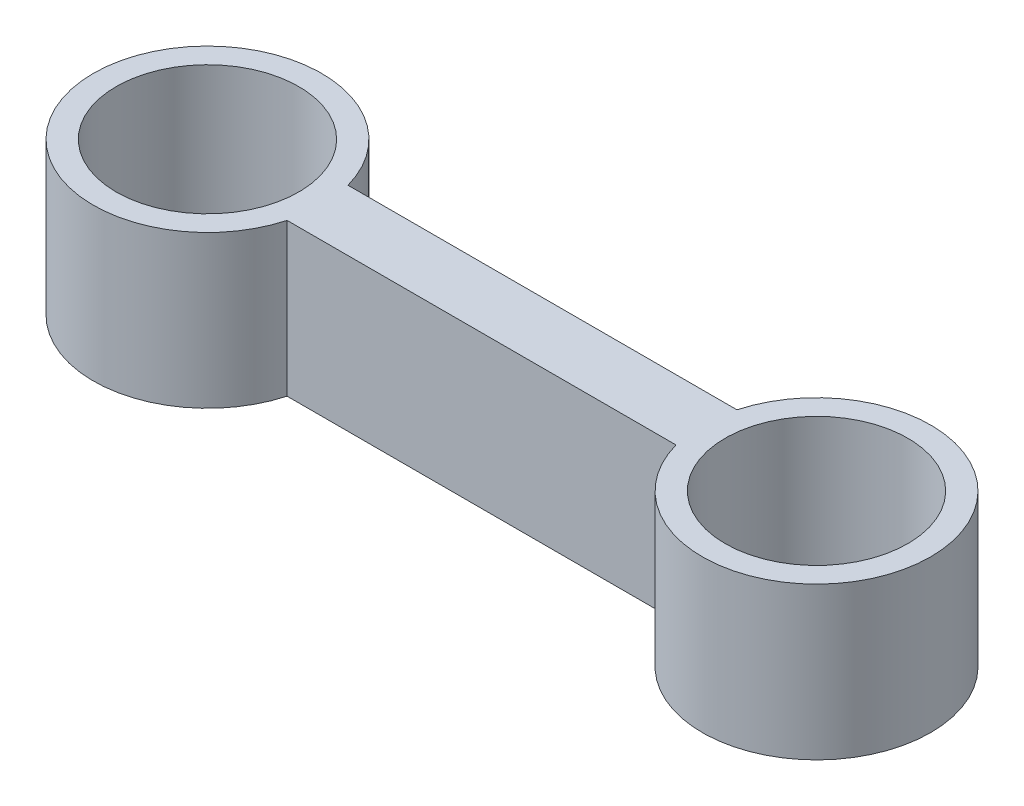
ISO-10303-21;
HEADER;
FILE_DESCRIPTION(('STEP AP214'),'2;1');
FILE_NAME('part.step','',(''),(''),'','','');
FILE_SCHEMA(('AUTOMOTIVE_DESIGN { 1 0 10303 214 1 1 1 1 }'));
ENDSEC;
DATA;
#1=APPLICATION_CONTEXT('core data for automotive mechanical design processes');
#2=APPLICATION_PROTOCOL_DEFINITION('international standard','automotive_design',2000,#1);
#3=PRODUCT_CONTEXT('',#1,'mechanical');
#4=PRODUCT('Part','Part','',(#3));
#5=PRODUCT_RELATED_PRODUCT_CATEGORY('part','',(#4));
#6=PRODUCT_DEFINITION_FORMATION('','',#4);
#7=PRODUCT_DEFINITION_CONTEXT('part definition',#1,'design');
#8=PRODUCT_DEFINITION('design','',#6,#7);
#9=PRODUCT_DEFINITION_SHAPE('','',#8);
#10=(LENGTH_UNIT() NAMED_UNIT(*) SI_UNIT(.MILLI.,.METRE.));
#11=(NAMED_UNIT(*) PLANE_ANGLE_UNIT() SI_UNIT($,.RADIAN.));
#12=(NAMED_UNIT(*) SI_UNIT($,.STERADIAN.) SOLID_ANGLE_UNIT());
#13=UNCERTAINTY_MEASURE_WITH_UNIT(LENGTH_MEASURE(1.E-05),#10,'distance_accuracy_value','');
#14=(GEOMETRIC_REPRESENTATION_CONTEXT(3) GLOBAL_UNCERTAINTY_ASSIGNED_CONTEXT((#13)) GLOBAL_UNIT_ASSIGNED_CONTEXT((#10,
#11,#12)) REPRESENTATION_CONTEXT('',''));
#15=CARTESIAN_POINT('',(0.,0.,0.));
#16=DIRECTION('',(0.,0.,1.));
#17=DIRECTION('',(1.,0.,0.));
#18=AXIS2_PLACEMENT_3D('',#15,#16,#17);
#19=CARTESIAN_POINT('',(0.,0.5,-0.2));
#20=DIRECTION('',(0.,0.,-1.));
#21=DIRECTION('',(-1.,0.,0.));
#22=AXIS2_PLACEMENT_3D('',#19,#20,#21);
#23=PLANE('',#22);
#24=DIRECTION('',(1.,0.,0.));
#25=VECTOR('',#24,1.);
#26=CARTESIAN_POINT('',(0.,-0.5,-0.2));
#27=LINE('',#26,#25);
#28=CARTESIAN_POINT('',(-1.27715838525995,-0.5,-0.2));
#29=VERTEX_POINT('',#28);
#30=CARTESIAN_POINT('',(1.27715838525995,-0.5,-0.2));
#31=VERTEX_POINT('',#30);
#32=EDGE_CURVE('E113',#29,#31,#27,.T.);
#33=ORIENTED_EDGE('',*,*,#32,.F.);
#34=DIRECTION('',(0.,-1.,0.));
#35=VECTOR('',#34,1.);
#36=CARTESIAN_POINT('',(-1.27715838525995,0.5,-0.2));
#37=LINE('',#36,#35);
#38=CARTESIAN_POINT('',(-1.27715838525995,0.5,-0.2));
#39=VERTEX_POINT('',#38);
#40=EDGE_CURVE('E11',#39,#29,#37,.T.);
#41=ORIENTED_EDGE('',*,*,#40,.F.);
#42=DIRECTION('',(1.,0.,0.));
#43=VECTOR('',#42,1.);
#44=CARTESIAN_POINT('',(0.,0.5,-0.2));
#45=LINE('',#44,#43);
#46=CARTESIAN_POINT('',(1.27715838525995,0.5,-0.2));
#47=VERTEX_POINT('',#46);
#48=EDGE_CURVE('E101',#39,#47,#45,.T.);
#49=ORIENTED_EDGE('',*,*,#48,.T.);
#50=DIRECTION('',(0.,-1.,0.));
#51=VECTOR('',#50,1.);
#52=CARTESIAN_POINT('',(1.27715838525995,0.5,-0.2));
#53=LINE('',#52,#51);
#54=EDGE_CURVE('E81',#47,#31,#53,.T.);
#55=ORIENTED_EDGE('',*,*,#54,.T.);
#56=EDGE_LOOP('',(#33,#41,#49,#55));
#57=FACE_BOUND('',#56,.T.);
#58=ADVANCED_FACE('F43',(#57),#23,.T.);
#59=CARTESIAN_POINT('',(-2.,0.5,0.));
#60=DIRECTION('',(0.,-1.,0.));
#61=DIRECTION('',(0.,0.,-1.));
#62=AXIS2_PLACEMENT_3D('',#59,#60,#61);
#63=CYLINDRICAL_SURFACE('',#62,0.75);
#64=CARTESIAN_POINT('',(-2.,-0.5,0.));
#65=DIRECTION('',(0.,1.,0.));
#66=DIRECTION('',(0.,0.,1.));
#67=AXIS2_PLACEMENT_3D('',#64,#65,#66);
#68=CIRCLE('',#67,0.75);
#69=CARTESIAN_POINT('',(-1.27715838525995,-0.5,0.2));
#70=VERTEX_POINT('',#69);
#71=EDGE_CURVE('E94',#70,#29,#68,.F.);
#72=ORIENTED_EDGE('',*,*,#71,.F.);
#73=DIRECTION('',(0.,-1.,0.));
#74=VECTOR('',#73,1.);
#75=CARTESIAN_POINT('',(-1.27715838525995,0.5,0.2));
#76=LINE('',#75,#74);
#77=CARTESIAN_POINT('',(-1.27715838525995,0.5,0.2));
#78=VERTEX_POINT('',#77);
#79=EDGE_CURVE('E51',#78,#70,#76,.T.);
#80=ORIENTED_EDGE('',*,*,#79,.F.);
#81=CARTESIAN_POINT('',(-2.,0.5,0.));
#82=DIRECTION('',(0.,1.,0.));
#83=DIRECTION('',(0.,0.,1.));
#84=AXIS2_PLACEMENT_3D('',#81,#82,#83);
#85=CIRCLE('',#84,0.75);
#86=EDGE_CURVE('E92',#78,#39,#85,.F.);
#87=ORIENTED_EDGE('',*,*,#86,.T.);
#88=ORIENTED_EDGE('',*,*,#40,.T.);
#89=EDGE_LOOP('',(#72,#80,#87,#88));
#90=FACE_BOUND('',#89,.T.);
#91=ADVANCED_FACE('F90',(#90),#63,.T.);
#92=CARTESIAN_POINT('',(0.,0.5,0.2));
#93=DIRECTION('',(0.,0.,-1.));
#94=DIRECTION('',(-1.,0.,0.));
#95=AXIS2_PLACEMENT_3D('',#92,#93,#94);
#96=PLANE('',#95);
#97=DIRECTION('',(1.,0.,0.));
#98=VECTOR('',#97,1.);
#99=CARTESIAN_POINT('',(0.,-0.5,0.2));
#100=LINE('',#99,#98);
#101=CARTESIAN_POINT('',(1.27715838525995,-0.5,0.2));
#102=VERTEX_POINT('',#101);
#103=EDGE_CURVE('E74',#70,#102,#100,.T.);
#104=ORIENTED_EDGE('',*,*,#103,.T.);
#105=DIRECTION('',(0.,-1.,0.));
#106=VECTOR('',#105,1.);
#107=CARTESIAN_POINT('',(1.27715838525995,0.5,0.2));
#108=LINE('',#107,#106);
#109=CARTESIAN_POINT('',(1.27715838525995,0.5,0.2));
#110=VERTEX_POINT('',#109);
#111=EDGE_CURVE('E95',#110,#102,#108,.T.);
#112=ORIENTED_EDGE('',*,*,#111,.F.);
#113=DIRECTION('',(1.,0.,0.));
#114=VECTOR('',#113,1.);
#115=CARTESIAN_POINT('',(0.,0.5,0.2));
#116=LINE('',#115,#114);
#117=EDGE_CURVE('E96',#78,#110,#116,.T.);
#118=ORIENTED_EDGE('',*,*,#117,.F.);
#119=ORIENTED_EDGE('',*,*,#79,.T.);
#120=EDGE_LOOP('',(#104,#112,#118,#119));
#121=FACE_BOUND('',#120,.T.);
#122=ADVANCED_FACE('F97',(#121),#96,.F.);
#123=CARTESIAN_POINT('',(2.,0.5,0.));
#124=DIRECTION('',(0.,-1.,0.));
#125=DIRECTION('',(0.,0.,-1.));
#126=AXIS2_PLACEMENT_3D('',#123,#124,#125);
#127=CYLINDRICAL_SURFACE('',#126,0.6);
#128=CARTESIAN_POINT('',(2.,0.5,0.));
#129=DIRECTION('',(0.,1.,0.));
#130=DIRECTION('',(0.,0.,1.));
#131=AXIS2_PLACEMENT_3D('',#128,#129,#130);
#132=CIRCLE('',#131,0.6);
#133=CARTESIAN_POINT('',(2.,0.5,0.6));
#134=VERTEX_POINT('',#133);
#135=EDGE_CURVE('E107',#134,#134,#132,.T.);
#136=ORIENTED_EDGE('',*,*,#135,.T.);
#137=EDGE_LOOP('',(#136));
#138=FACE_BOUND('',#137,.T.);
#139=CARTESIAN_POINT('',(2.,-0.5,0.));
#140=DIRECTION('',(0.,1.,0.));
#141=DIRECTION('',(0.,0.,1.));
#142=AXIS2_PLACEMENT_3D('',#139,#140,#141);
#143=CIRCLE('',#142,0.6);
#144=CARTESIAN_POINT('',(2.,-0.5,0.6));
#145=VERTEX_POINT('',#144);
#146=EDGE_CURVE('E120',#145,#145,#143,.T.);
#147=ORIENTED_EDGE('',*,*,#146,.F.);
#148=EDGE_LOOP('',(#147));
#149=FACE_BOUND('',#148,.T.);
#150=ADVANCED_FACE('F139',(#138,#149),#127,.F.);
#151=CARTESIAN_POINT('',(2.,0.5,0.));
#152=DIRECTION('',(0.,-1.,0.));
#153=DIRECTION('',(0.,0.,-1.));
#154=AXIS2_PLACEMENT_3D('',#151,#152,#153);
#155=CYLINDRICAL_SURFACE('',#154,0.75);
#156=CARTESIAN_POINT('',(2.,-0.5,0.));
#157=DIRECTION('',(0.,1.,0.));
#158=DIRECTION('',(0.,0.,1.));
#159=AXIS2_PLACEMENT_3D('',#156,#157,#158);
#160=CIRCLE('',#159,0.75);
#161=EDGE_CURVE('E118',#102,#31,#160,.T.);
#162=ORIENTED_EDGE('',*,*,#161,.T.);
#163=ORIENTED_EDGE('',*,*,#54,.F.);
#164=CARTESIAN_POINT('',(2.,0.5,0.));
#165=DIRECTION('',(0.,1.,0.));
#166=DIRECTION('',(0.,0.,1.));
#167=AXIS2_PLACEMENT_3D('',#164,#165,#166);
#168=CIRCLE('',#167,0.75);
#169=EDGE_CURVE('E59',#110,#47,#168,.T.);
#170=ORIENTED_EDGE('',*,*,#169,.F.);
#171=ORIENTED_EDGE('',*,*,#111,.T.);
#172=EDGE_LOOP('',(#162,#163,#170,#171));
#173=FACE_BOUND('',#172,.T.);
#174=ADVANCED_FACE('F128',(#173),#155,.T.);
#175=CARTESIAN_POINT('',(-2.,0.5,0.));
#176=DIRECTION('',(0.,-1.,0.));
#177=DIRECTION('',(0.,0.,-1.));
#178=AXIS2_PLACEMENT_3D('',#175,#176,#177);
#179=CYLINDRICAL_SURFACE('',#178,0.6);
#180=CARTESIAN_POINT('',(-2.,0.5,0.));
#181=DIRECTION('',(0.,1.,0.));
#182=DIRECTION('',(0.,0.,1.));
#183=AXIS2_PLACEMENT_3D('',#180,#181,#182);
#184=CIRCLE('',#183,0.6);
#185=CARTESIAN_POINT('',(-2.,0.5,0.6));
#186=VERTEX_POINT('',#185);
#187=EDGE_CURVE('E110',#186,#186,#184,.F.);
#188=ORIENTED_EDGE('',*,*,#187,.F.);
#189=EDGE_LOOP('',(#188));
#190=FACE_BOUND('',#189,.T.);
#191=CARTESIAN_POINT('',(-2.,-0.5,0.));
#192=DIRECTION('',(0.,1.,0.));
#193=DIRECTION('',(0.,0.,1.));
#194=AXIS2_PLACEMENT_3D('',#191,#192,#193);
#195=CIRCLE('',#194,0.6);
#196=CARTESIAN_POINT('',(-2.,-0.5,0.6));
#197=VERTEX_POINT('',#196);
#198=EDGE_CURVE('E103',#197,#197,#195,.F.);
#199=ORIENTED_EDGE('',*,*,#198,.T.);
#200=EDGE_LOOP('',(#199));
#201=FACE_BOUND('',#200,.T.);
#202=ADVANCED_FACE('F144',(#190,#201),#179,.F.);
#203=CARTESIAN_POINT('',(0.,0.5,0.));
#204=DIRECTION('',(0.,1.,0.));
#205=DIRECTION('',(0.,0.,1.));
#206=AXIS2_PLACEMENT_3D('',#203,#204,#205);
#207=PLANE('',#206);
#208=ORIENTED_EDGE('',*,*,#48,.F.);
#209=ORIENTED_EDGE('',*,*,#86,.F.);
#210=ORIENTED_EDGE('',*,*,#117,.T.);
#211=ORIENTED_EDGE('',*,*,#169,.T.);
#212=EDGE_LOOP('',(#208,#209,#210,#211));
#213=FACE_BOUND('',#212,.T.);
#214=ORIENTED_EDGE('',*,*,#135,.F.);
#215=EDGE_LOOP('',(#214));
#216=FACE_BOUND('',#215,.T.);
#217=ORIENTED_EDGE('',*,*,#187,.T.);
#218=EDGE_LOOP('',(#217));
#219=FACE_BOUND('',#218,.T.);
#220=ADVANCED_FACE('F99',(#213,#216,#219),#207,.T.);
#221=CARTESIAN_POINT('',(0.,-0.5,0.));
#222=DIRECTION('',(0.,1.,0.));
#223=DIRECTION('',(0.,0.,1.));
#224=AXIS2_PLACEMENT_3D('',#221,#222,#223);
#225=PLANE('',#224);
#226=ORIENTED_EDGE('',*,*,#32,.T.);
#227=ORIENTED_EDGE('',*,*,#161,.F.);
#228=ORIENTED_EDGE('',*,*,#103,.F.);
#229=ORIENTED_EDGE('',*,*,#71,.T.);
#230=EDGE_LOOP('',(#226,#227,#228,#229));
#231=FACE_BOUND('',#230,.T.);
#232=ORIENTED_EDGE('',*,*,#146,.T.);
#233=EDGE_LOOP('',(#232));
#234=FACE_BOUND('',#233,.T.);
#235=ORIENTED_EDGE('',*,*,#198,.F.);
#236=EDGE_LOOP('',(#235));
#237=FACE_BOUND('',#236,.T.);
#238=ADVANCED_FACE('F130',(#231,#234,#237),#225,.F.);
#239=CLOSED_SHELL('',(#58,#91,#122,#150,#174,#202,#220,#238));
#240=MANIFOLD_SOLID_BREP('B2',#239);
#241=ADVANCED_BREP_SHAPE_REPRESENTATION('',(#18,#240),#14);
#242=SHAPE_DEFINITION_REPRESENTATION(#9,#241);
ENDSEC;
END-ISO-10303-21;
